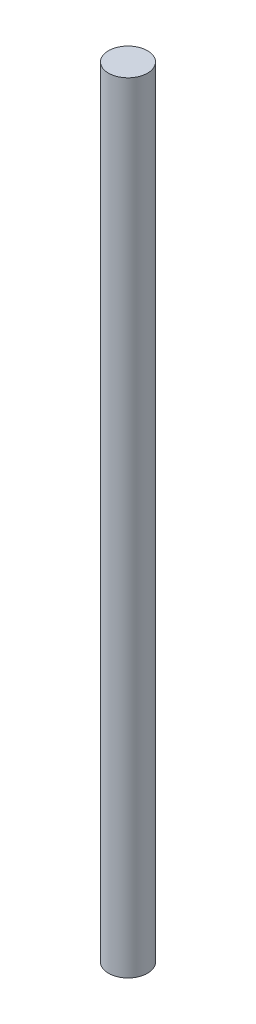
ISO-10303-21;
HEADER;
FILE_DESCRIPTION(('STEP AP214'),'2;1');
FILE_NAME('part.step','',(''),(''),'','','');
FILE_SCHEMA(('AUTOMOTIVE_DESIGN { 1 0 10303 214 1 1 1 1 }'));
ENDSEC;
DATA;
#1=APPLICATION_CONTEXT('core data for automotive mechanical design processes');
#2=APPLICATION_PROTOCOL_DEFINITION('international standard','automotive_design',2000,#1);
#3=PRODUCT_CONTEXT('',#1,'mechanical');
#4=PRODUCT('Part','Part','',(#3));
#5=PRODUCT_RELATED_PRODUCT_CATEGORY('part','',(#4));
#6=PRODUCT_DEFINITION_FORMATION('','',#4);
#7=PRODUCT_DEFINITION_CONTEXT('part definition',#1,'design');
#8=PRODUCT_DEFINITION('design','',#6,#7);
#9=PRODUCT_DEFINITION_SHAPE('','',#8);
#10=(LENGTH_UNIT() NAMED_UNIT(*) SI_UNIT(.MILLI.,.METRE.));
#11=(NAMED_UNIT(*) PLANE_ANGLE_UNIT() SI_UNIT($,.RADIAN.));
#12=(NAMED_UNIT(*) SI_UNIT($,.STERADIAN.) SOLID_ANGLE_UNIT());
#13=UNCERTAINTY_MEASURE_WITH_UNIT(LENGTH_MEASURE(1.E-05),#10,'distance_accuracy_value','');
#14=(GEOMETRIC_REPRESENTATION_CONTEXT(3) GLOBAL_UNCERTAINTY_ASSIGNED_CONTEXT((#13)) GLOBAL_UNIT_ASSIGNED_CONTEXT((#10,
#11,#12)) REPRESENTATION_CONTEXT('',''));
#15=CARTESIAN_POINT('',(0.,0.,0.));
#16=DIRECTION('',(0.,0.,1.));
#17=DIRECTION('',(1.,0.,0.));
#18=AXIS2_PLACEMENT_3D('',#15,#16,#17);
#19=CARTESIAN_POINT('',(0.,100.,0.277302139213434));
#20=DIRECTION('',(0.,-1.,0.));
#21=DIRECTION('',(0.,0.,-1.));
#22=AXIS2_PLACEMENT_3D('',#19,#20,#21);
#23=CYLINDRICAL_SURFACE('',#22,2.5);
#24=CARTESIAN_POINT('',(0.,100.,0.277302139213434));
#25=DIRECTION('',(0.,1.,0.));
#26=DIRECTION('',(0.,0.,1.));
#27=AXIS2_PLACEMENT_3D('',#24,#25,#26);
#28=CIRCLE('',#27,2.5);
#29=CARTESIAN_POINT('',(0.,100.,2.77730213921343));
#30=VERTEX_POINT('',#29);
#31=EDGE_CURVE('E10',#30,#30,#28,.T.);
#32=ORIENTED_EDGE('',*,*,#31,.F.);
#33=EDGE_LOOP('',(#32));
#34=FACE_BOUND('',#33,.T.);
#35=CARTESIAN_POINT('',(0.,0.,0.277302139213434));
#36=DIRECTION('',(0.,1.,0.));
#37=DIRECTION('',(0.,0.,1.));
#38=AXIS2_PLACEMENT_3D('',#35,#36,#37);
#39=CIRCLE('',#38,2.5);
#40=CARTESIAN_POINT('',(0.,0.,2.77730213921343));
#41=VERTEX_POINT('',#40);
#42=EDGE_CURVE('E36',#41,#41,#39,.T.);
#43=ORIENTED_EDGE('',*,*,#42,.T.);
#44=EDGE_LOOP('',(#43));
#45=FACE_BOUND('',#44,.T.);
#46=ADVANCED_FACE('F33',(#34,#45),#23,.T.);
#47=CARTESIAN_POINT('',(0.,100.,0.277302139213434));
#48=DIRECTION('',(0.,1.,0.));
#49=DIRECTION('',(0.,0.,1.));
#50=AXIS2_PLACEMENT_3D('',#47,#48,#49);
#51=PLANE('',#50);
#52=ORIENTED_EDGE('',*,*,#31,.T.);
#53=EDGE_LOOP('',(#52));
#54=FACE_BOUND('',#53,.T.);
#55=ADVANCED_FACE('F48',(#54),#51,.T.);
#56=CARTESIAN_POINT('',(0.,0.,0.277302139213434));
#57=DIRECTION('',(0.,1.,0.));
#58=DIRECTION('',(0.,0.,1.));
#59=AXIS2_PLACEMENT_3D('',#56,#57,#58);
#60=PLANE('',#59);
#61=ORIENTED_EDGE('',*,*,#42,.F.);
#62=EDGE_LOOP('',(#61));
#63=FACE_BOUND('',#62,.T.);
#64=ADVANCED_FACE('F46',(#63),#60,.F.);
#65=CLOSED_SHELL('',(#46,#55,#64));
#66=MANIFOLD_SOLID_BREP('B2',#65);
#67=ADVANCED_BREP_SHAPE_REPRESENTATION('',(#18,#66),#14);
#68=SHAPE_DEFINITION_REPRESENTATION(#9,#67);
ENDSEC;
END-ISO-10303-21;
